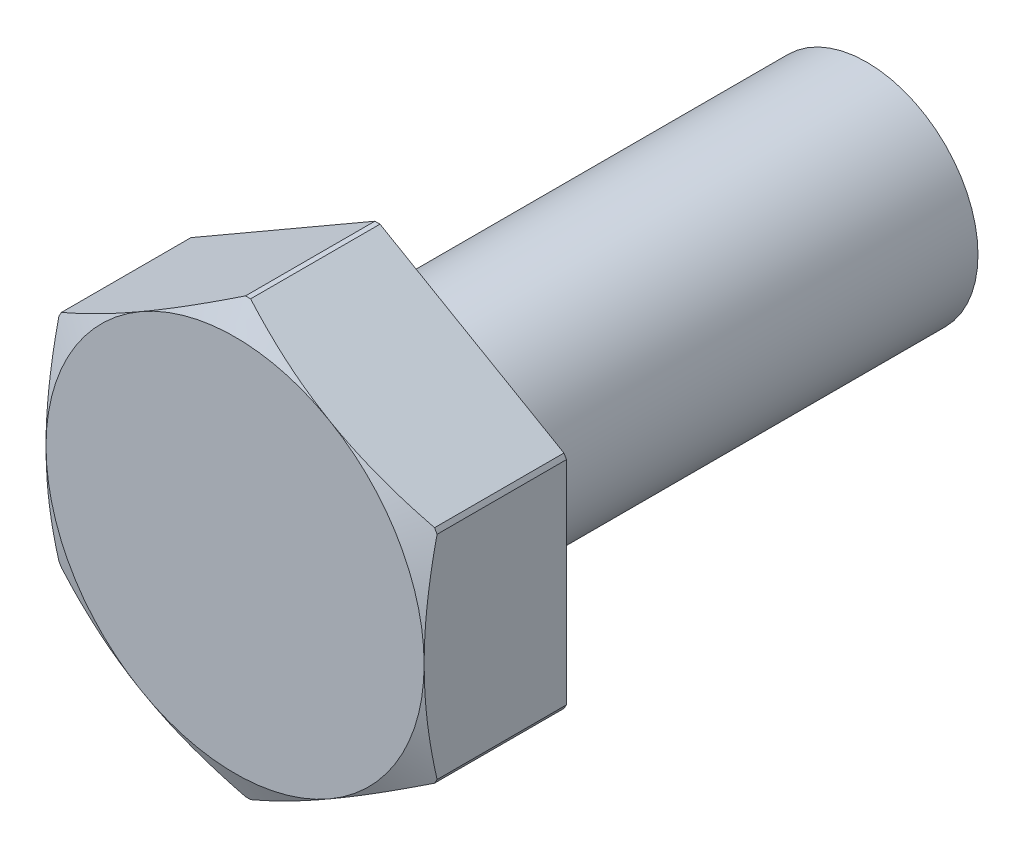
ISO-10303-21;
HEADER;
FILE_DESCRIPTION(('STEP AP214'),'2;1');
FILE_NAME('part.step','',(''),(''),'','','');
FILE_SCHEMA(('AUTOMOTIVE_DESIGN { 1 0 10303 214 1 1 1 1 }'));
ENDSEC;
DATA;
#1=APPLICATION_CONTEXT('core data for automotive mechanical design processes');
#2=APPLICATION_PROTOCOL_DEFINITION('international standard','automotive_design',2000,#1);
#3=PRODUCT_CONTEXT('',#1,'mechanical');
#4=PRODUCT('Part','Part','',(#3));
#5=PRODUCT_RELATED_PRODUCT_CATEGORY('part','',(#4));
#6=PRODUCT_DEFINITION_FORMATION('','',#4);
#7=PRODUCT_DEFINITION_CONTEXT('part definition',#1,'design');
#8=PRODUCT_DEFINITION('design','',#6,#7);
#9=PRODUCT_DEFINITION_SHAPE('','',#8);
#10=(LENGTH_UNIT() NAMED_UNIT(*) SI_UNIT(.MILLI.,.METRE.));
#11=(NAMED_UNIT(*) PLANE_ANGLE_UNIT() SI_UNIT($,.RADIAN.));
#12=(NAMED_UNIT(*) SI_UNIT($,.STERADIAN.) SOLID_ANGLE_UNIT());
#13=UNCERTAINTY_MEASURE_WITH_UNIT(LENGTH_MEASURE(1.E-05),#10,'distance_accuracy_value','');
#14=(GEOMETRIC_REPRESENTATION_CONTEXT(3) GLOBAL_UNCERTAINTY_ASSIGNED_CONTEXT((#13)) GLOBAL_UNIT_ASSIGNED_CONTEXT((#10,
#11,#12)) REPRESENTATION_CONTEXT('',''));
#15=CARTESIAN_POINT('',(0.,0.,0.));
#16=DIRECTION('',(0.,0.,1.));
#17=DIRECTION('',(1.,0.,0.));
#18=AXIS2_PLACEMENT_3D('',#15,#16,#17);
#19=CARTESIAN_POINT('',(0.,0.,0.));
#20=DIRECTION('',(0.,0.,-1.));
#21=DIRECTION('',(0.,1.,0.));
#22=AXIS2_PLACEMENT_3D('',#19,#20,#21);
#23=CYLINDRICAL_SURFACE('',#22,5.);
#24=CARTESIAN_POINT('',(0.,0.,0.));
#25=DIRECTION('',(0.,0.,-1.));
#26=DIRECTION('',(-1.,0.,0.));
#27=AXIS2_PLACEMENT_3D('',#24,#25,#26);
#28=CIRCLE('',#27,5.);
#29=CARTESIAN_POINT('',(-5.,0.,0.));
#30=VERTEX_POINT('',#29);
#31=EDGE_CURVE('E202',#30,#30,#28,.F.);
#32=ORIENTED_EDGE('',*,*,#31,.F.);
#33=EDGE_LOOP('',(#32));
#34=FACE_BOUND('',#33,.T.);
#35=CARTESIAN_POINT('',(0.,0.,-22.));
#36=DIRECTION('',(0.,0.,-1.));
#37=DIRECTION('',(0.,1.,0.));
#38=AXIS2_PLACEMENT_3D('',#35,#36,#37);
#39=CIRCLE('',#38,5.);
#40=CARTESIAN_POINT('',(0.,5.,-22.));
#41=VERTEX_POINT('',#40);
#42=EDGE_CURVE('E205',#41,#41,#39,.T.);
#43=ORIENTED_EDGE('',*,*,#42,.F.);
#44=EDGE_LOOP('',(#43));
#45=FACE_BOUND('',#44,.T.);
#46=ADVANCED_FACE('F41',(#34,#45),#23,.T.);
#47=CARTESIAN_POINT('',(0.,0.,-22.));
#48=DIRECTION('',(0.,0.,-1.));
#49=DIRECTION('',(0.,1.,0.));
#50=AXIS2_PLACEMENT_3D('',#47,#48,#49);
#51=PLANE('',#50);
#52=ORIENTED_EDGE('',*,*,#42,.T.);
#53=EDGE_LOOP('',(#52));
#54=FACE_BOUND('',#53,.T.);
#55=ADVANCED_FACE('F327',(#54),#51,.T.);
#56=CARTESIAN_POINT('',(8.49999999999999,4.90747728811183,6.4));
#57=DIRECTION('',(-0.5,-0.866025403784438,0.));
#58=DIRECTION('',(0.866025403784439,-0.5,0.));
#59=AXIS2_PLACEMENT_3D('',#56,#57,#58);
#60=PLANE('',#59);
#61=DIRECTION('',(-0.866025403784439,0.5,0.));
#62=VECTOR('',#61,1.);
#63=CARTESIAN_POINT('',(8.49999999999999,4.90747728811183,0.));
#64=LINE('',#63,#62);
#65=CARTESIAN_POINT('',(8.38494566049247,4.97390394199793,0.));
#66=VERTEX_POINT('',#65);
#67=CARTESIAN_POINT('',(0.115054339507531,9.74852792233753,0.));
#68=VERTEX_POINT('',#67);
#69=EDGE_CURVE('E168',#66,#68,#64,.T.);
#70=ORIENTED_EDGE('',*,*,#69,.T.);
#71=DIRECTION('',(0.,0.,-1.));
#72=VECTOR('',#71,1.);
#73=CARTESIAN_POINT('',(0.115054339507526,9.74852792233753,0.));
#74=LINE('',#73,#72);
#75=CARTESIAN_POINT('',(0.115054339507535,9.74852792233753,5.81748528043192));
#76=VERTEX_POINT('',#75);
#77=EDGE_CURVE('E148',#68,#76,#74,.F.);
#78=ORIENTED_EDGE('',*,*,#77,.T.);
#79=CARTESIAN_POINT('',(0.114295957680367,9.74896577428959,5.81728528043192));
#80=CARTESIAN_POINT('',(0.368748378519884,9.60205760062195,5.88439408273517));
#81=CARTESIAN_POINT('',(0.624132610704913,9.45461144542313,5.94704387090896));
#82=CARTESIAN_POINT('',(1.13678161552989,9.15863340448764,6.0619326461379));
#83=CARTESIAN_POINT('',(1.39404729707737,9.01010099399295,6.11416620210143));
#84=CARTESIAN_POINT('',(1.91041340277676,8.711976883867,6.20669299734237));
#85=CARTESIAN_POINT('',(2.16951510638425,8.56238444554173,6.24697685046727));
#86=CARTESIAN_POINT('',(2.68898544678042,8.26246810467798,6.31413320836077));
#87=CARTESIAN_POINT('',(2.94935384329133,8.11214434086393,6.34100816361651));
#88=CARTESIAN_POINT('',(3.46568333302973,7.81404137097292,6.37989393997882));
#89=CARTESIAN_POINT('',(3.72162799990124,7.66627164865701,6.39219226634545));
#90=CARTESIAN_POINT('',(4.23375156730204,7.3705969691598,6.40238558113719));
#91=CARTESIAN_POINT('',(4.4899304812466,7.22269200423321,6.40027968527784));
#92=CARTESIAN_POINT('',(5.00166928701166,6.92723946696997,6.38176001965257));
#93=CARTESIAN_POINT('',(5.25722952429058,6.77969169518282,6.36535876678634));
#94=CARTESIAN_POINT('',(5.76738905749601,6.48515095135702,6.31893257207433));
#95=CARTESIAN_POINT('',(6.02198844109896,6.33815792869834,6.28890890512109));
#96=CARTESIAN_POINT('',(6.45259775243271,6.08954552688424,6.22738921407857));
#97=CARTESIAN_POINT('',(6.62896152815605,5.98772185349507,6.19911759925731));
#98=CARTESIAN_POINT('',(6.98093458100912,5.78451011668285,6.13697504631877));
#99=CARTESIAN_POINT('',(7.15654391144361,5.6831220224843,6.10310451069344));
#100=CARTESIAN_POINT('',(7.50824732553324,5.48006596168473,6.02997476402398));
#101=CARTESIAN_POINT('',(7.68433547306051,5.37840142230876,5.99067774752279));
#102=CARTESIAN_POINT('',(8.03565930027249,5.1755645160952,5.90738378565997));
#103=CARTESIAN_POINT('',(8.21089506378212,5.07439210086126,5.86338731263727));
#104=CARTESIAN_POINT('',(8.38570404232108,4.97346609004503,5.81728528043154));
#105=B_SPLINE_CURVE_WITH_KNOTS('',3,(#79,#80,#81,#82,#83,#84,#85,#86,#87,#88,#89,#90,#91,#92,
#93,#94,#95,#96,#97,#98,#99,#100,#101,#102,#103,#104),.UNSPECIFIED.,.F.,.F.,(4,2,2,2,2,2,2,2,2,
2,2,2,4),(0.,0.904197868867345,1.80886596676229,2.71424278554767,3.61945408531317,
4.50649730500268,5.39359498133453,6.27991670148044,7.16615548978059,7.78288131449349,
8.39956282364626,9.02078053104709,9.64193585895891),.UNSPECIFIED.);
#106=CARTESIAN_POINT('',(4.25,7.36121593216773,6.4));
#107=VERTEX_POINT('',#106);
#108=EDGE_CURVE('E177',#76,#107,#105,.T.);
#109=ORIENTED_EDGE('',*,*,#108,.T.);
#110=CARTESIAN_POINT('',(8.38494566049246,4.97390394199793,5.81748528043192));
#111=VERTEX_POINT('',#110);
#112=EDGE_CURVE('E181',#107,#111,#105,.T.);
#113=ORIENTED_EDGE('',*,*,#112,.T.);
#114=DIRECTION('',(0.,0.,-1.));
#115=VECTOR('',#114,1.);
#116=CARTESIAN_POINT('',(8.38494566049247,4.97390394199792,0.));
#117=LINE('',#116,#115);
#118=EDGE_CURVE('E159',#111,#66,#117,.T.);
#119=ORIENTED_EDGE('',*,*,#118,.T.);
#120=EDGE_LOOP('',(#70,#78,#109,#113,#119));
#121=FACE_BOUND('',#120,.T.);
#122=ADVANCED_FACE('F175',(#121),#60,.F.);
#123=CARTESIAN_POINT('',(0.,9.81495457622364,6.4));
#124=DIRECTION('',(0.5,-0.866025403784439,0.));
#125=DIRECTION('',(0.866025403784439,0.5,0.));
#126=AXIS2_PLACEMENT_3D('',#123,#124,#125);
#127=PLANE('',#126);
#128=DIRECTION('',(-0.866025403784439,-0.5,0.));
#129=VECTOR('',#128,1.);
#130=CARTESIAN_POINT('',(0.,9.81495457622364,0.));
#131=LINE('',#130,#129);
#132=CARTESIAN_POINT('',(-0.115054339507537,9.74852792233753,0.));
#133=VERTEX_POINT('',#132);
#134=CARTESIAN_POINT('',(-8.38494566049246,4.97390394199793,0.));
#135=VERTEX_POINT('',#134);
#136=EDGE_CURVE('E171',#133,#135,#131,.T.);
#137=ORIENTED_EDGE('',*,*,#136,.T.);
#138=DIRECTION('',(0.,0.,-1.));
#139=VECTOR('',#138,1.);
#140=CARTESIAN_POINT('',(-8.38494566049246,4.97390394199793,0.));
#141=LINE('',#140,#139);
#142=CARTESIAN_POINT('',(-8.38494566049246,4.97390394199794,5.81748528043192));
#143=VERTEX_POINT('',#142);
#144=EDGE_CURVE('E260',#135,#143,#141,.F.);
#145=ORIENTED_EDGE('',*,*,#144,.T.);
#146=CARTESIAN_POINT('',(-8.38570404232108,4.97346609004504,5.81728528043153));
#147=CARTESIAN_POINT('',(-8.13125162148153,5.1203742637127,5.88439408273481));
#148=CARTESIAN_POINT('',(-7.87586738929647,5.26782041891153,5.94704387090863));
#149=CARTESIAN_POINT('',(-7.36321838447143,5.56379845984706,6.06193264613762));
#150=CARTESIAN_POINT('',(-7.10595270292392,5.71233087034177,6.11416620210118));
#151=CARTESIAN_POINT('',(-6.58958659722446,6.01045498046775,6.20669299734217));
#152=CARTESIAN_POINT('',(-6.33048489361693,6.16004741879305,6.2469768504671));
#153=CARTESIAN_POINT('',(-5.8110145532207,6.45996375965684,6.31413320836065));
#154=CARTESIAN_POINT('',(-5.55064615670975,6.61028752347091,6.3410081636164));
#155=CARTESIAN_POINT('',(-5.03431666697128,6.90839049336195,6.37989393997877));
#156=CARTESIAN_POINT('',(-4.77837200009974,7.05616021567789,6.39219226634541));
#157=CARTESIAN_POINT('',(-4.26624843269887,7.35183489517513,6.40238558113719));
#158=CARTESIAN_POINT('',(-4.01006951875427,7.49973986010175,6.40027968527785));
#159=CARTESIAN_POINT('',(-3.49833071298915,7.79519239736502,6.38176001965262));
#160=CARTESIAN_POINT('',(-3.24277047571019,7.94274016915219,6.36535876678639));
#161=CARTESIAN_POINT('',(-2.73261094250469,8.23728091297804,6.3189325720744));
#162=CARTESIAN_POINT('',(-2.47801155890171,8.38427393563674,6.28890890512118));
#163=CARTESIAN_POINT('',(-2.04740224756799,8.63288633745081,6.22738921407868));
#164=CARTESIAN_POINT('',(-1.87103847184471,8.73471001083995,6.19911759925743));
#165=CARTESIAN_POINT('',(-1.51906541899178,8.93792174765208,6.13697504631894));
#166=CARTESIAN_POINT('',(-1.34345608855737,9.0393098418506,6.10310451069363));
#167=CARTESIAN_POINT('',(-0.991752674467875,9.24236590265008,6.02997476402422));
#168=CARTESIAN_POINT('',(-0.815664526940676,9.34403044202601,5.99067774752306));
#169=CARTESIAN_POINT('',(-0.464340699728832,9.5468673482395,5.9073837856603));
#170=CARTESIAN_POINT('',(-0.28910493621927,9.6480397634734,5.86338731263763));
#171=CARTESIAN_POINT('',(-0.114295957680373,9.74896577428959,5.81728528043192));
#172=B_SPLINE_CURVE_WITH_KNOTS('',3,(#146,#147,#148,#149,#150,#151,#152,#153,#154,#155,#156,
#157,#158,#159,#160,#161,#162,#163,#164,#165,#166,#167,#168,#169,#170,#171),.UNSPECIFIED.,.F.,
.F.,(4,2,2,2,2,2,2,2,2,2,2,2,4),(0.,0.904197868867468,1.80886596676253,2.71424278554804,
3.61945408531367,4.5064973050033,5.39359498133527,6.27991670148131,7.16615548978157,
7.78288131449423,8.39956282364675,9.02078053104733,9.6419358589589),.UNSPECIFIED.);
#173=CARTESIAN_POINT('',(-4.25,7.36121593216773,6.4));
#174=VERTEX_POINT('',#173);
#175=EDGE_CURVE('E320',#143,#174,#172,.T.);
#176=ORIENTED_EDGE('',*,*,#175,.T.);
#177=CARTESIAN_POINT('',(-0.115054339507542,9.74852792233753,5.81748528043192));
#178=VERTEX_POINT('',#177);
#179=EDGE_CURVE('E314',#174,#178,#172,.T.);
#180=ORIENTED_EDGE('',*,*,#179,.T.);
#181=DIRECTION('',(0.,0.,-1.));
#182=VECTOR('',#181,1.);
#183=CARTESIAN_POINT('',(-0.115054339507535,9.74852792233753,0.));
#184=LINE('',#183,#182);
#185=EDGE_CURVE('E258',#178,#133,#184,.T.);
#186=ORIENTED_EDGE('',*,*,#185,.T.);
#187=EDGE_LOOP('',(#137,#145,#176,#180,#186));
#188=FACE_BOUND('',#187,.T.);
#189=ADVANCED_FACE('F321',(#188),#127,.F.);
#190=CARTESIAN_POINT('',(-8.49999999999999,4.90747728811183,6.4));
#191=DIRECTION('',(1.,0.,0.));
#192=DIRECTION('',(0.,1.,0.));
#193=AXIS2_PLACEMENT_3D('',#190,#191,#192);
#194=PLANE('',#193);
#195=DIRECTION('',(0.,-1.,0.));
#196=VECTOR('',#195,1.);
#197=CARTESIAN_POINT('',(-8.49999999999999,4.90747728811183,0.));
#198=LINE('',#197,#196);
#199=CARTESIAN_POINT('',(-8.49999999999999,4.77462398033962,0.));
#200=VERTEX_POINT('',#199);
#201=CARTESIAN_POINT('',(-8.49999999999999,-4.77462398033962,0.));
#202=VERTEX_POINT('',#201);
#203=EDGE_CURVE('E179',#200,#202,#198,.T.);
#204=ORIENTED_EDGE('',*,*,#203,.T.);
#205=DIRECTION('',(0.,0.,-1.));
#206=VECTOR('',#205,1.);
#207=CARTESIAN_POINT('',(-8.49999999999998,-4.77462398033963,0.));
#208=LINE('',#207,#206);
#209=CARTESIAN_POINT('',(-8.49999999999999,-4.77462398033962,5.81748528043192));
#210=VERTEX_POINT('',#209);
#211=EDGE_CURVE('E255',#202,#210,#208,.F.);
#212=ORIENTED_EDGE('',*,*,#211,.T.);
#213=CARTESIAN_POINT('',(-8.49999999999998,-13.0055728494876,3.1186446895037));
#214=CARTESIAN_POINT('',(-8.49999999999998,-12.6236113714636,3.26769442816254));
#215=CARTESIAN_POINT('',(-8.49999999999998,-12.2410019908623,3.41511460764558));
#216=CARTESIAN_POINT('',(-8.49999999999998,-11.4741438552404,3.70577155724618));
#217=CARTESIAN_POINT('',(-8.49999999999998,-11.0898948981786,3.84900779366108));
#218=CARTESIAN_POINT('',(-8.49999999999998,-10.3182049069868,4.13081114994341));
#219=CARTESIAN_POINT('',(-8.49999999999999,-9.93075746722823,4.26936079239417));
#220=CARTESIAN_POINT('',(-8.49999999999999,-9.15360678955333,4.53996371788897));
#221=CARTESIAN_POINT('',(-8.49999999999999,-8.76390363027252,4.67201722588508));
#222=CARTESIAN_POINT('',(-8.49999999999999,-7.98699304569603,4.92625020867573));
#223=CARTESIAN_POINT('',(-8.49999999999999,-7.59982104407757,5.04853739168555));
#224=CARTESIAN_POINT('',(-8.49999999999999,-6.82240006662922,5.28305967827671));
#225=CARTESIAN_POINT('',(-8.49999999999999,-6.43215093269667,5.39529426164652));
#226=CARTESIAN_POINT('',(-8.49999999999999,-5.64857586601971,5.60694510843903));
#227=CARTESIAN_POINT('',(-8.49999999999999,-5.2552533403401,5.70637388176925));
#228=CARTESIAN_POINT('',(-8.49999999999999,-4.4649154233197,5.8892987888121));
#229=CARTESIAN_POINT('',(-8.49999999999999,-4.0679005555984,5.97279714658327));
#230=CARTESIAN_POINT('',(-8.49999999999999,-3.3966927498546,6.09683587343487));
#231=CARTESIAN_POINT('',(-8.49999999999999,-3.12346599596478,6.14260286278407));
#232=CARTESIAN_POINT('',(-8.49999999999999,-2.57547327150274,6.22382192646634));
#233=CARTESIAN_POINT('',(-8.49999999999999,-2.3007073387721,6.25927425326671));
#234=CARTESIAN_POINT('',(-8.49999999999999,-1.75006498070165,6.31878757848712));
#235=CARTESIAN_POINT('',(-8.49999999999999,-1.47418914552003,6.34285398542085));
#236=CARTESIAN_POINT('',(-8.49999999999999,-0.921638292007667,6.37880951798559));
#237=CARTESIAN_POINT('',(-8.49999999999999,-0.644963280134812,6.39069874174205));
#238=CARTESIAN_POINT('',(-8.49999999999999,-0.0901817416354904,6.40189266512031));
#239=CARTESIAN_POINT('',(-8.49999999999999,0.187925880798553,6.40114379453006));
#240=CARTESIAN_POINT('',(-8.49999999999999,0.743816318512034,6.38695860508124));
#241=CARTESIAN_POINT('',(-8.49999999999999,1.02159912940412,6.37352211678394));
#242=CARTESIAN_POINT('',(-8.49999999999999,1.57634660652873,6.33444562684688));
#243=CARTESIAN_POINT('',(-8.49999999999999,1.85331112395366,6.30880352835232));
#244=CARTESIAN_POINT('',(-8.49999999999999,2.4059211960765,6.24617960593438));
#245=CARTESIAN_POINT('',(-8.49999999999999,2.68156679098249,6.20919812996402));
#246=CARTESIAN_POINT('',(-8.49999999999999,3.69910269416636,6.05332554763144));
#247=CARTESIAN_POINT('',(-8.49999999999999,4.43614530865584,5.90214348220122));
#248=CARTESIAN_POINT('',(-8.49999999999999,5.53206397682524,5.63671689769451));
#249=CARTESIAN_POINT('',(-8.49999999999999,5.89599323424382,5.54172568544557));
#250=CARTESIAN_POINT('',(-8.49999999999999,6.62097423389572,5.34128183556652));
#251=CARTESIAN_POINT('',(-8.49999999999999,6.98202615484924,5.23582985324529));
#252=CARTESIAN_POINT('',(-8.49999999999999,7.70352621406965,5.01591066544456));
#253=CARTESIAN_POINT('',(-8.49999999999999,8.06395995575284,4.90139680265189));
#254=CARTESIAN_POINT('',(-8.49999999999999,8.78257893874545,4.66552285346253));
#255=CARTESIAN_POINT('',(-8.49999999999999,9.14076415606734,4.54416269416617));
#256=CARTESIAN_POINT('',(-8.49999999999999,9.85503014903381,4.29596971049876));
#257=CARTESIAN_POINT('',(-8.49999999999999,10.2111118651333,4.16913958182559));
#258=CARTESIAN_POINT('',(-8.49999999999999,10.921634077964,3.91097969067251));
#259=CARTESIAN_POINT('',(-8.49999999999999,11.2760745844378,3.77964995494277));
#260=CARTESIAN_POINT('',(-8.49999999999999,11.9849239673444,3.51278760846573));
#261=CARTESIAN_POINT('',(-8.49999999999999,12.3393274788915,3.37724077552879));
#262=CARTESIAN_POINT('',(-8.49999999999999,13.0469426613599,3.1030677935147));
#263=CARTESIAN_POINT('',(-8.5,13.4001543221802,2.96444161841502));
#264=CARTESIAN_POINT('',(-8.5,14.458355679725,2.54470720998344));
#265=CARTESIAN_POINT('',(-8.5,15.1618282124487,2.25977483981285));
#266=CARTESIAN_POINT('',(-8.5,16.5568272047265,1.68638397809293));
#267=CARTESIAN_POINT('',(-8.5,17.2483914691913,1.3980170321228));
#268=CARTESIAN_POINT('',(-8.5,18.2840178194632,0.9616037785216));
#269=CARTESIAN_POINT('',(-8.5,18.628902471974,0.815505005247487));
#270=CARTESIAN_POINT('',(-8.5,19.3181874227747,0.522174840015516));
#271=CARTESIAN_POINT('',(-8.5,19.6625877239855,0.374943454923121));
#272=CARTESIAN_POINT('',(-8.5,20.0067797905317,0.22722736956378));
#273=B_SPLINE_CURVE_WITH_KNOTS('',3,(#213,#214,#215,#216,#217,#218,#219,#220,#221,#222,#223,
#224,#225,#226,#227,#228,#229,#230,#231,#232,#233,#234,#235,#236,#237,#238,#239,#240,#241,#242,
#243,#244,#245,#246,#247,#248,#249,#250,#251,#252,#253,#254,#255,#256,#257,#258,#259,#260,#261,
#262,#263,#264,#265,#266,#267,#268,#269,#270,#271,#272),.UNSPECIFIED.,.F.,.F.,(4,2,2,2,2,2,2,2,
2,2,2,2,2,2,2,2,2,2,2,2,2,2,2,2,2,2,2,2,2,4),(0.,1.2300510540079,2.46025833380435,
3.69463667636664,4.92897224399588,6.14694106702368,7.364972882294,8.58180563672979,
9.79846838362138,10.6294008191662,11.4603129146447,12.2908299148731,13.1213402226265,
13.9553717690376,14.7894144538069,15.6236004741332,16.4577608997119,18.7114943596639,
19.8398110234478,20.9680570490705,22.1025462924587,23.2370476182184,24.3709960913688,
25.504937824363,26.6432408835412,27.7815535658139,30.0584470047,32.3062535012335,
33.4299120943287,34.5535638815888),.UNSPECIFIED.);
#274=CARTESIAN_POINT('',(-8.49999999999999,0.,6.4));
#275=VERTEX_POINT('',#274);
#276=EDGE_CURVE('E313',#210,#275,#273,.T.);
#277=ORIENTED_EDGE('',*,*,#276,.T.);
#278=CARTESIAN_POINT('',(-8.49999999999999,4.77462398033961,5.81748528043192));
#279=VERTEX_POINT('',#278);
#280=EDGE_CURVE('E307',#275,#279,#273,.T.);
#281=ORIENTED_EDGE('',*,*,#280,.T.);
#282=DIRECTION('',(0.,0.,-1.));
#283=VECTOR('',#282,1.);
#284=CARTESIAN_POINT('',(-8.49999999999999,4.77462398033962,0.));
#285=LINE('',#284,#283);
#286=EDGE_CURVE('E253',#279,#200,#285,.T.);
#287=ORIENTED_EDGE('',*,*,#286,.T.);
#288=EDGE_LOOP('',(#204,#212,#277,#281,#287));
#289=FACE_BOUND('',#288,.T.);
#290=ADVANCED_FACE('F294',(#289),#194,.F.);
#291=CARTESIAN_POINT('',(-8.49999999999999,-4.90747728811182,6.4));
#292=DIRECTION('',(0.5,0.866025403784439,0.));
#293=DIRECTION('',(-0.866025403784439,0.5,0.));
#294=AXIS2_PLACEMENT_3D('',#291,#292,#293);
#295=PLANE('',#294);
#296=DIRECTION('',(0.866025403784439,-0.5,0.));
#297=VECTOR('',#296,1.);
#298=CARTESIAN_POINT('',(-8.49999999999999,-4.90747728811182,0.));
#299=LINE('',#298,#297);
#300=CARTESIAN_POINT('',(-8.38494566049247,-4.97390394199792,0.));
#301=VERTEX_POINT('',#300);
#302=CARTESIAN_POINT('',(-0.115054339507517,-9.74852792233753,0.));
#303=VERTEX_POINT('',#302);
#304=EDGE_CURVE('E193',#301,#303,#299,.T.);
#305=ORIENTED_EDGE('',*,*,#304,.T.);
#306=DIRECTION('',(0.,0.,-1.));
#307=VECTOR('',#306,1.);
#308=CARTESIAN_POINT('',(-0.115054339507515,-9.74852792233753,0.));
#309=LINE('',#308,#307);
#310=CARTESIAN_POINT('',(-0.115054339507517,-9.74852792233753,5.81748528043192));
#311=VERTEX_POINT('',#310);
#312=EDGE_CURVE('E250',#303,#311,#309,.F.);
#313=ORIENTED_EDGE('',*,*,#312,.T.);
#314=CARTESIAN_POINT('',(-0.114295957680362,-9.74896577428959,5.81728528043192));
#315=CARTESIAN_POINT('',(-0.368748378519878,-9.60205760062194,5.88439408273517));
#316=CARTESIAN_POINT('',(-0.624132610704907,-9.45461144542313,5.94704387090896));
#317=CARTESIAN_POINT('',(-1.13678161552988,-9.15863340448764,6.0619326461379));
#318=CARTESIAN_POINT('',(-1.39404729707736,-9.01010099399294,6.11416620210143));
#319=CARTESIAN_POINT('',(-1.91041340277676,-8.711976883867,6.20669299734237));
#320=CARTESIAN_POINT('',(-2.16951510638425,-8.56238444554173,6.24697685046727));
#321=CARTESIAN_POINT('',(-2.68898544678041,-8.26246810467797,6.31413320836077));
#322=CARTESIAN_POINT('',(-2.94935384329133,-8.11214434086393,6.34100816361651));
#323=CARTESIAN_POINT('',(-3.46568333302972,-7.81404137097292,6.37989393997882));
#324=CARTESIAN_POINT('',(-3.72162799990123,-7.66627164865701,6.39219226634545));
#325=CARTESIAN_POINT('',(-4.23375156730204,-7.3705969691598,6.40238558113719));
#326=CARTESIAN_POINT('',(-4.48993048124659,-7.2226920042332,6.40027968527784));
#327=CARTESIAN_POINT('',(-5.00166928701165,-6.92723946696997,6.38176001965258));
#328=CARTESIAN_POINT('',(-5.25722952429057,-6.77969169518282,6.36535876678634));
#329=CARTESIAN_POINT('',(-5.767389057496,-6.48515095135701,6.31893257207433));
#330=CARTESIAN_POINT('',(-6.02198844109895,-6.33815792869834,6.28890890512109));
#331=CARTESIAN_POINT('',(-6.4525977524327,-6.08954552688424,6.22738921407858));
#332=CARTESIAN_POINT('',(-6.62896152815605,-5.98772185349506,6.19911759925731));
#333=CARTESIAN_POINT('',(-6.98093458100912,-5.78451011668285,6.13697504631877));
#334=CARTESIAN_POINT('',(-7.1565439114436,-5.68312202248429,6.10310451069344));
#335=CARTESIAN_POINT('',(-7.50824732553324,-5.48006596168473,6.02997476402398));
#336=CARTESIAN_POINT('',(-7.68433547306051,-5.37840142230876,5.9906777475228));
#337=CARTESIAN_POINT('',(-8.03565930027249,-5.17556451609519,5.90738378565997));
#338=CARTESIAN_POINT('',(-8.21089506378212,-5.07439210086125,5.86338731263727));
#339=CARTESIAN_POINT('',(-8.38570404232109,-4.97346609004502,5.81728528043154));
#340=B_SPLINE_CURVE_WITH_KNOTS('',3,(#314,#315,#316,#317,#318,#319,#320,#321,#322,#323,#324,
#325,#326,#327,#328,#329,#330,#331,#332,#333,#334,#335,#336,#337,#338,#339),.UNSPECIFIED.,.F.,
.F.,(4,2,2,2,2,2,2,2,2,2,2,2,4),(0.,0.904197868867344,1.80886596676229,2.71424278554767,
3.61945408531317,4.50649730500267,5.39359498133452,6.27991670148044,7.16615548978058,
7.78288131449349,8.39956282364627,9.02078053104709,9.64193585895892),.UNSPECIFIED.);
#341=CARTESIAN_POINT('',(-4.25,-7.36121593216773,6.4));
#342=VERTEX_POINT('',#341);
#343=EDGE_CURVE('E305',#311,#342,#340,.T.);
#344=ORIENTED_EDGE('',*,*,#343,.T.);
#345=CARTESIAN_POINT('',(-8.38494566049248,-4.97390394199792,5.81748528043192));
#346=VERTEX_POINT('',#345);
#347=EDGE_CURVE('E298',#342,#346,#340,.T.);
#348=ORIENTED_EDGE('',*,*,#347,.T.);
#349=DIRECTION('',(0.,0.,-1.));
#350=VECTOR('',#349,1.);
#351=CARTESIAN_POINT('',(-8.38494566049248,-4.97390394199791,0.));
#352=LINE('',#351,#350);
#353=EDGE_CURVE('E248',#346,#301,#352,.T.);
#354=ORIENTED_EDGE('',*,*,#353,.T.);
#355=EDGE_LOOP('',(#305,#313,#344,#348,#354));
#356=FACE_BOUND('',#355,.T.);
#357=ADVANCED_FACE('F289',(#356),#295,.F.);
#358=CARTESIAN_POINT('',(0.,-9.81495457622363,6.4));
#359=DIRECTION('',(-0.5,0.866025403784439,0.));
#360=DIRECTION('',(-0.866025403784439,-0.5,0.));
#361=AXIS2_PLACEMENT_3D('',#358,#359,#360);
#362=PLANE('',#361);
#363=DIRECTION('',(0.866025403784439,0.5,0.));
#364=VECTOR('',#363,1.);
#365=CARTESIAN_POINT('',(0.,-9.81495457622363,0.));
#366=LINE('',#365,#364);
#367=CARTESIAN_POINT('',(0.115054339507521,-9.74852792233753,0.));
#368=VERTEX_POINT('',#367);
#369=CARTESIAN_POINT('',(8.38494566049247,-4.97390394199793,0.));
#370=VERTEX_POINT('',#369);
#371=EDGE_CURVE('E196',#368,#370,#366,.T.);
#372=ORIENTED_EDGE('',*,*,#371,.T.);
#373=DIRECTION('',(0.,0.,-1.));
#374=VECTOR('',#373,1.);
#375=CARTESIAN_POINT('',(8.38494566049247,-4.97390394199793,0.));
#376=LINE('',#375,#374);
#377=CARTESIAN_POINT('',(8.38494566049247,-4.97390394199793,5.81748528043192));
#378=VERTEX_POINT('',#377);
#379=EDGE_CURVE('E245',#370,#378,#376,.F.);
#380=ORIENTED_EDGE('',*,*,#379,.T.);
#381=CARTESIAN_POINT('',(8.38570404232108,-4.97346609004502,5.81728528043153));
#382=CARTESIAN_POINT('',(8.13125162148154,-5.12037426371269,5.88439408273482));
#383=CARTESIAN_POINT('',(7.87586738929648,-5.26782041891152,5.94704387090863));
#384=CARTESIAN_POINT('',(7.36321838447144,-5.56379845984705,6.06193264613762));
#385=CARTESIAN_POINT('',(7.10595270292392,-5.71233087034176,6.11416620210118));
#386=CARTESIAN_POINT('',(6.58958659722446,-6.01045498046774,6.20669299734217));
#387=CARTESIAN_POINT('',(6.33048489361694,-6.16004741879303,6.2469768504671));
#388=CARTESIAN_POINT('',(5.8110145532207,-6.45996375965683,6.31413320836065));
#389=CARTESIAN_POINT('',(5.55064615670975,-6.61028752347089,6.34100816361641));
#390=CARTESIAN_POINT('',(5.03431666697129,-6.90839049336194,6.37989393997877));
#391=CARTESIAN_POINT('',(4.77837200009974,-7.05616021567787,6.39219226634541));
#392=CARTESIAN_POINT('',(4.26624843269887,-7.35183489517512,6.40238558113719));
#393=CARTESIAN_POINT('',(4.01006951875428,-7.49973986010174,6.40027968527786));
#394=CARTESIAN_POINT('',(3.49833071298915,-7.79519239736501,6.38176001965262));
#395=CARTESIAN_POINT('',(3.24277047571019,-7.94274016915218,6.3653587667864));
#396=CARTESIAN_POINT('',(2.7326109425047,-8.23728091297803,6.31893257207441));
#397=CARTESIAN_POINT('',(2.47801155890171,-8.38427393563672,6.28890890512118));
#398=CARTESIAN_POINT('',(2.047402247568,-8.6328863374508,6.22738921407869));
#399=CARTESIAN_POINT('',(1.87103847184472,-8.73471001083994,6.19911759925744));
#400=CARTESIAN_POINT('',(1.51906541899178,-8.93792174765207,6.13697504631894));
#401=CARTESIAN_POINT('',(1.34345608855737,-9.03930984185059,6.10310451069364));
#402=CARTESIAN_POINT('',(0.991752674467869,-9.24236590265007,6.02997476402422));
#403=CARTESIAN_POINT('',(0.815664526940669,-9.34403044202601,5.99067774752306));
#404=CARTESIAN_POINT('',(0.464340699728822,-9.54686734823949,5.9073837856603));
#405=CARTESIAN_POINT('',(0.289104936219259,-9.64803976347339,5.86338731263763));
#406=CARTESIAN_POINT('',(0.11429595768036,-9.74896577428959,5.81728528043192));
#407=B_SPLINE_CURVE_WITH_KNOTS('',3,(#381,#382,#383,#384,#385,#386,#387,#388,#389,#390,#391,
#392,#393,#394,#395,#396,#397,#398,#399,#400,#401,#402,#403,#404,#405,#406),.UNSPECIFIED.,.F.,
.F.,(4,2,2,2,2,2,2,2,2,2,2,2,4),(0.,0.904197868867468,1.80886596676253,2.71424278554804,
3.61945408531367,4.5064973050033,5.39359498133527,6.27991670148131,7.16615548978157,
7.78288131449423,8.39956282364676,9.02078053104734,9.64193585895892),.UNSPECIFIED.);
#408=CARTESIAN_POINT('',(4.24999999999999,-7.36121593216773,6.4));
#409=VERTEX_POINT('',#408);
#410=EDGE_CURVE('E306',#378,#409,#407,.T.);
#411=ORIENTED_EDGE('',*,*,#410,.T.);
#412=CARTESIAN_POINT('',(0.11505433950752,-9.74852792233753,5.81748528043192));
#413=VERTEX_POINT('',#412);
#414=EDGE_CURVE('E271',#409,#413,#407,.T.);
#415=ORIENTED_EDGE('',*,*,#414,.T.);
#416=DIRECTION('',(0.,0.,-1.));
#417=VECTOR('',#416,1.);
#418=CARTESIAN_POINT('',(0.11505433950752,-9.74852792233753,0.));
#419=LINE('',#418,#417);
#420=EDGE_CURVE('E238',#413,#368,#419,.T.);
#421=ORIENTED_EDGE('',*,*,#420,.T.);
#422=EDGE_LOOP('',(#372,#380,#411,#415,#421));
#423=FACE_BOUND('',#422,.T.);
#424=ADVANCED_FACE('F284',(#423),#362,.F.);
#425=CARTESIAN_POINT('',(8.49999999999999,-4.90747728811182,6.4));
#426=DIRECTION('',(-1.,0.,0.));
#427=DIRECTION('',(0.,-1.,0.));
#428=AXIS2_PLACEMENT_3D('',#425,#426,#427);
#429=PLANE('',#428);
#430=DIRECTION('',(0.,1.,0.));
#431=VECTOR('',#430,1.);
#432=CARTESIAN_POINT('',(8.49999999999999,-4.90747728811182,0.));
#433=LINE('',#432,#431);
#434=CARTESIAN_POINT('',(8.49999999999999,-4.77462398033962,0.));
#435=VERTEX_POINT('',#434);
#436=CARTESIAN_POINT('',(8.49999999999999,4.77462398033962,0.));
#437=VERTEX_POINT('',#436);
#438=EDGE_CURVE('E199',#435,#437,#433,.T.);
#439=ORIENTED_EDGE('',*,*,#438,.T.);
#440=DIRECTION('',(0.,0.,-1.));
#441=VECTOR('',#440,1.);
#442=CARTESIAN_POINT('',(8.49999999999998,4.77462398033963,0.));
#443=LINE('',#442,#441);
#444=CARTESIAN_POINT('',(8.49999999999999,4.77462398033962,5.81748528043192));
#445=VERTEX_POINT('',#444);
#446=EDGE_CURVE('E227',#437,#445,#443,.F.);
#447=ORIENTED_EDGE('',*,*,#446,.T.);
#448=CARTESIAN_POINT('',(8.49999999999999,-13.0055728494878,3.11864468950364));
#449=CARTESIAN_POINT('',(8.49999999999999,-12.6236113714637,3.26769442816247));
#450=CARTESIAN_POINT('',(8.49999999999999,-12.2410019908625,3.41511460764551));
#451=CARTESIAN_POINT('',(8.49999999999999,-11.4741438552406,3.70577155724611));
#452=CARTESIAN_POINT('',(8.49999999999999,-11.0898948981788,3.84900779366102));
#453=CARTESIAN_POINT('',(8.49999999999999,-10.318204906987,4.13081114994335));
#454=CARTESIAN_POINT('',(8.49999999999999,-9.93075746722839,4.26936079239411));
#455=CARTESIAN_POINT('',(8.49999999999999,-9.15360678955349,4.53996371788891));
#456=CARTESIAN_POINT('',(8.49999999999999,-8.76390363027268,4.67201722588503));
#457=CARTESIAN_POINT('',(8.49999999999999,-7.98699304569619,4.92625020867568));
#458=CARTESIAN_POINT('',(8.49999999999999,-7.59982104407772,5.0485373916855));
#459=CARTESIAN_POINT('',(8.49999999999999,-6.82240006662938,5.28305967827667));
#460=CARTESIAN_POINT('',(8.49999999999999,-6.43215093269682,5.39529426164648));
#461=CARTESIAN_POINT('',(8.49999999999999,-5.64857586601987,5.606945108439));
#462=CARTESIAN_POINT('',(8.49999999999999,-5.25525334034025,5.70637388176921));
#463=CARTESIAN_POINT('',(8.49999999999999,-4.46491542331985,5.88929878881207));
#464=CARTESIAN_POINT('',(8.49999999999999,-4.06790055559855,5.97279714658324));
#465=CARTESIAN_POINT('',(8.49999999999999,-3.39669274985475,6.09683587343485));
#466=CARTESIAN_POINT('',(8.49999999999999,-3.12346599596493,6.14260286278405));
#467=CARTESIAN_POINT('',(8.49999999999999,-2.57547327150288,6.22382192646632));
#468=CARTESIAN_POINT('',(8.49999999999999,-2.30070733877224,6.25927425326669));
#469=CARTESIAN_POINT('',(8.49999999999999,-1.75006498070179,6.31878757848711));
#470=CARTESIAN_POINT('',(8.49999999999999,-1.47418914552017,6.34285398542084));
#471=CARTESIAN_POINT('',(8.49999999999999,-0.921638292007797,6.37880951798558));
#472=CARTESIAN_POINT('',(8.49999999999999,-0.64496328013494,6.39069874174204));
#473=CARTESIAN_POINT('',(8.49999999999999,-0.0901817416356153,6.40189266512031));
#474=CARTESIAN_POINT('',(8.49999999999999,0.18792588079843,6.40114379453007));
#475=CARTESIAN_POINT('',(8.49999999999999,0.743816318511913,6.38695860508124));
#476=CARTESIAN_POINT('',(8.49999999999999,1.021599129404,6.37352211678395));
#477=CARTESIAN_POINT('',(8.49999999999999,1.57634660652861,6.33444562684689));
#478=CARTESIAN_POINT('',(8.49999999999999,1.85331112395354,6.30880352835233));
#479=CARTESIAN_POINT('',(8.49999999999999,2.40592119607639,6.24617960593439));
#480=CARTESIAN_POINT('',(8.49999999999999,2.68156679098239,6.20919812996403));
#481=CARTESIAN_POINT('',(8.49999999999999,3.69910269416626,6.05332554763146));
#482=CARTESIAN_POINT('',(8.49999999999999,4.43614530865574,5.90214348220125));
#483=CARTESIAN_POINT('',(8.49999999999999,5.53206397682513,5.63671689769453));
#484=CARTESIAN_POINT('',(8.49999999999999,5.89599323424371,5.5417256854456));
#485=CARTESIAN_POINT('',(8.49999999999999,6.62097423389561,5.34128183556655));
#486=CARTESIAN_POINT('',(8.49999999999999,6.98202615484913,5.23582985324532));
#487=CARTESIAN_POINT('',(8.49999999999999,7.70352621406954,5.01591066544459));
#488=CARTESIAN_POINT('',(8.49999999999999,8.06395995575273,4.90139680265193));
#489=CARTESIAN_POINT('',(8.49999999999999,8.78257893874534,4.66552285346257));
#490=CARTESIAN_POINT('',(8.49999999999999,9.14076415606723,4.54416269416621));
#491=CARTESIAN_POINT('',(8.49999999999999,9.8550301490337,4.2959697104988));
#492=CARTESIAN_POINT('',(8.49999999999998,10.2111118651332,4.16913958182563));
#493=CARTESIAN_POINT('',(8.49999999999998,10.9216340779639,3.91097969067255));
#494=CARTESIAN_POINT('',(8.49999999999998,11.2760745844377,3.77964995494281));
#495=CARTESIAN_POINT('',(8.49999999999998,11.9849239673443,3.51278760846577));
#496=CARTESIAN_POINT('',(8.49999999999998,12.3393274788914,3.37724077552883));
#497=CARTESIAN_POINT('',(8.49999999999998,13.0469426613598,3.10306779351475));
#498=CARTESIAN_POINT('',(8.49999999999998,13.4001543221801,2.96444161841507));
#499=CARTESIAN_POINT('',(8.49999999999998,14.4583556797249,2.54470720998348));
#500=CARTESIAN_POINT('',(8.49999999999998,15.1618282124486,2.25977483981289));
#501=CARTESIAN_POINT('',(8.49999999999998,16.5568272047264,1.68638397809298));
#502=CARTESIAN_POINT('',(8.49999999999998,17.2483914691912,1.39801703212285));
#503=CARTESIAN_POINT('',(8.49999999999998,18.2840178194631,0.961603778521642));
#504=CARTESIAN_POINT('',(8.49999999999998,18.6289024719739,0.815505005247528));
#505=CARTESIAN_POINT('',(8.49999999999998,19.3181874227746,0.522174840015555));
#506=CARTESIAN_POINT('',(8.49999999999998,19.6625877239854,0.374943454923162));
#507=CARTESIAN_POINT('',(8.49999999999998,20.0067797905316,0.227227369563821));
#508=B_SPLINE_CURVE_WITH_KNOTS('',3,(#448,#449,#450,#451,#452,#453,#454,#455,#456,#457,#458,
#459,#460,#461,#462,#463,#464,#465,#466,#467,#468,#469,#470,#471,#472,#473,#474,#475,#476,#477,
#478,#479,#480,#481,#482,#483,#484,#485,#486,#487,#488,#489,#490,#491,#492,#493,#494,#495,#496,
#497,#498,#499,#500,#501,#502,#503,#504,#505,#506,#507),.UNSPECIFIED.,.F.,.F.,(4,2,2,2,2,2,2,2,
2,2,2,2,2,2,2,2,2,2,2,2,2,2,2,2,2,2,2,2,2,4),(0.,1.2300510540079,2.46025833380436,
3.69463667636664,4.92897224399588,6.14694106702369,7.36497288229402,8.58180563672981,
9.7984683836214,10.6294008191662,11.4603129146447,12.2908299148731,13.1213402226266,
13.9553717690377,14.789414453807,15.6236004741333,16.457760899712,18.711494359664,
19.8398110234479,20.9680570490706,22.1025462924587,23.2370476182185,24.3709960913689,
25.5049378243631,26.6432408835412,27.781553565814,30.0584470047001,32.3062535012336,
33.4299120943288,34.5535638815889),.UNSPECIFIED.);
#509=CARTESIAN_POINT('',(8.5,0.,6.4));
#510=VERTEX_POINT('',#509);
#511=EDGE_CURVE('E270',#445,#510,#508,.F.);
#512=ORIENTED_EDGE('',*,*,#511,.T.);
#513=CARTESIAN_POINT('',(8.49999999999999,-4.77462398033962,5.81748528043192));
#514=VERTEX_POINT('',#513);
#515=EDGE_CURVE('E158',#510,#514,#508,.F.);
#516=ORIENTED_EDGE('',*,*,#515,.T.);
#517=DIRECTION('',(0.,0.,-1.));
#518=VECTOR('',#517,1.);
#519=CARTESIAN_POINT('',(8.49999999999998,-4.77462398033963,0.));
#520=LINE('',#519,#518);
#521=EDGE_CURVE('E233',#514,#435,#520,.T.);
#522=ORIENTED_EDGE('',*,*,#521,.T.);
#523=EDGE_LOOP('',(#439,#447,#512,#516,#522));
#524=FACE_BOUND('',#523,.T.);
#525=ADVANCED_FACE('F230',(#524),#429,.F.);
#526=CARTESIAN_POINT('',(8.49999999999999,4.90747728811183,0.));
#527=DIRECTION('',(0.,0.,-1.));
#528=DIRECTION('',(-1.,0.,0.));
#529=AXIS2_PLACEMENT_3D('',#526,#527,#528);
#530=PLANE('',#529);
#531=CARTESIAN_POINT('',(0.,0.,0.));
#532=DIRECTION('',(0.,0.,-1.));
#533=DIRECTION('',(-1.,0.,0.));
#534=AXIS2_PLACEMENT_3D('',#531,#532,#533);
#535=CIRCLE('',#534,9.74920684741246);
#536=EDGE_CURVE('E207',#202,#301,#535,.F.);
#537=ORIENTED_EDGE('',*,*,#536,.F.);
#538=ORIENTED_EDGE('',*,*,#203,.F.);
#539=EDGE_CURVE('E173',#135,#200,#535,.F.);
#540=ORIENTED_EDGE('',*,*,#539,.F.);
#541=ORIENTED_EDGE('',*,*,#136,.F.);
#542=EDGE_CURVE('E151',#68,#133,#535,.F.);
#543=ORIENTED_EDGE('',*,*,#542,.F.);
#544=ORIENTED_EDGE('',*,*,#69,.F.);
#545=EDGE_CURVE('E172',#437,#66,#535,.F.);
#546=ORIENTED_EDGE('',*,*,#545,.F.);
#547=ORIENTED_EDGE('',*,*,#438,.F.);
#548=EDGE_CURVE('E215',#370,#435,#535,.F.);
#549=ORIENTED_EDGE('',*,*,#548,.F.);
#550=ORIENTED_EDGE('',*,*,#371,.F.);
#551=EDGE_CURVE('E210',#303,#368,#535,.F.);
#552=ORIENTED_EDGE('',*,*,#551,.F.);
#553=ORIENTED_EDGE('',*,*,#304,.F.);
#554=EDGE_LOOP('',(#537,#538,#540,#541,#543,#544,#546,#547,#549,#550,#552,#553));
#555=FACE_BOUND('',#554,.T.);
#556=ORIENTED_EDGE('',*,*,#31,.T.);
#557=EDGE_LOOP('',(#556));
#558=FACE_BOUND('',#557,.T.);
#559=ADVANCED_FACE('F165',(#555,#558),#530,.T.);
#560=CARTESIAN_POINT('',(0.,0.,0.));
#561=DIRECTION('',(0.,0.,-1.));
#562=DIRECTION('',(0.,1.,0.));
#563=AXIS2_PLACEMENT_3D('',#560,#561,#562);
#564=CYLINDRICAL_SURFACE('',#563,9.74920684741246);
#565=ORIENTED_EDGE('',*,*,#539,.T.);
#566=ORIENTED_EDGE('',*,*,#286,.F.);
#567=CARTESIAN_POINT('',(0.,0.,5.81748528043192));
#568=DIRECTION('',(0.,0.,-1.));
#569=DIRECTION('',(0.,1.,0.));
#570=AXIS2_PLACEMENT_3D('',#567,#568,#569);
#571=CIRCLE('',#570,9.74920684741246);
#572=EDGE_CURVE('E398',#279,#143,#571,.T.);
#573=ORIENTED_EDGE('',*,*,#572,.T.);
#574=ORIENTED_EDGE('',*,*,#144,.F.);
#575=EDGE_LOOP('',(#565,#566,#573,#574));
#576=FACE_BOUND('',#575,.T.);
#577=ADVANCED_FACE('F340',(#576),#564,.T.);
#578=CARTESIAN_POINT('',(0.,0.,6.4));
#579=DIRECTION('',(0.,0.,-1.));
#580=DIRECTION('',(0.,1.,0.));
#581=AXIS2_PLACEMENT_3D('',#578,#579,#580);
#582=CONICAL_SURFACE('',#581,8.5,1.13446401379632);
#583=ORIENTED_EDGE('',*,*,#572,.F.);
#584=ORIENTED_EDGE('',*,*,#280,.F.);
#585=CARTESIAN_POINT('',(0.,0.,6.4));
#586=DIRECTION('',(0.,0.,-1.));
#587=DIRECTION('',(-1.,0.,0.));
#588=AXIS2_PLACEMENT_3D('',#585,#586,#587);
#589=CIRCLE('',#588,8.49999999999999);
#590=EDGE_CURVE('E44',#174,#275,#589,.F.);
#591=ORIENTED_EDGE('',*,*,#590,.F.);
#592=ORIENTED_EDGE('',*,*,#175,.F.);
#593=EDGE_LOOP('',(#583,#584,#591,#592));
#594=FACE_BOUND('',#593,.T.);
#595=ADVANCED_FACE('F344',(#594),#582,.T.);
#596=ORIENTED_EDGE('',*,*,#542,.T.);
#597=ORIENTED_EDGE('',*,*,#185,.F.);
#598=EDGE_CURVE('E154',#178,#76,#571,.T.);
#599=ORIENTED_EDGE('',*,*,#598,.T.);
#600=ORIENTED_EDGE('',*,*,#77,.F.);
#601=EDGE_LOOP('',(#596,#597,#599,#600));
#602=FACE_BOUND('',#601,.T.);
#603=ADVANCED_FACE('F150',(#602),#564,.T.);
#604=ORIENTED_EDGE('',*,*,#598,.F.);
#605=ORIENTED_EDGE('',*,*,#179,.F.);
#606=EDGE_CURVE('E214',#107,#174,#589,.F.);
#607=ORIENTED_EDGE('',*,*,#606,.F.);
#608=ORIENTED_EDGE('',*,*,#108,.F.);
#609=EDGE_LOOP('',(#604,#605,#607,#608));
#610=FACE_BOUND('',#609,.T.);
#611=ADVANCED_FACE('F278',(#610),#582,.T.);
#612=EDGE_CURVE('E236',#111,#445,#571,.T.);
#613=ORIENTED_EDGE('',*,*,#612,.T.);
#614=ORIENTED_EDGE('',*,*,#446,.F.);
#615=ORIENTED_EDGE('',*,*,#545,.T.);
#616=ORIENTED_EDGE('',*,*,#118,.F.);
#617=EDGE_LOOP('',(#613,#614,#615,#616));
#618=FACE_BOUND('',#617,.T.);
#619=ADVANCED_FACE('F224',(#618),#564,.T.);
#620=CARTESIAN_POINT('',(0.,0.,6.4));
#621=DIRECTION('',(0.,0.,-1.));
#622=DIRECTION('',(0.,1.,0.));
#623=AXIS2_PLACEMENT_3D('',#620,#621,#622);
#624=CIRCLE('',#623,8.5);
#625=EDGE_CURVE('E391',#107,#510,#624,.T.);
#626=ORIENTED_EDGE('',*,*,#625,.T.);
#627=ORIENTED_EDGE('',*,*,#511,.F.);
#628=ORIENTED_EDGE('',*,*,#612,.F.);
#629=ORIENTED_EDGE('',*,*,#112,.F.);
#630=EDGE_LOOP('',(#626,#627,#628,#629));
#631=FACE_BOUND('',#630,.T.);
#632=ADVANCED_FACE('F351',(#631),#582,.T.);
#633=ORIENTED_EDGE('',*,*,#548,.T.);
#634=ORIENTED_EDGE('',*,*,#521,.F.);
#635=EDGE_CURVE('E240',#514,#378,#571,.T.);
#636=ORIENTED_EDGE('',*,*,#635,.T.);
#637=ORIENTED_EDGE('',*,*,#379,.F.);
#638=EDGE_LOOP('',(#633,#634,#636,#637));
#639=FACE_BOUND('',#638,.T.);
#640=ADVANCED_FACE('F360',(#639),#564,.T.);
#641=ORIENTED_EDGE('',*,*,#635,.F.);
#642=ORIENTED_EDGE('',*,*,#515,.F.);
#643=EDGE_CURVE('E63',#409,#510,#589,.F.);
#644=ORIENTED_EDGE('',*,*,#643,.F.);
#645=ORIENTED_EDGE('',*,*,#410,.F.);
#646=EDGE_LOOP('',(#641,#642,#644,#645));
#647=FACE_BOUND('',#646,.T.);
#648=ADVANCED_FACE('F363',(#647),#582,.T.);
#649=ORIENTED_EDGE('',*,*,#551,.T.);
#650=ORIENTED_EDGE('',*,*,#420,.F.);
#651=EDGE_CURVE('E382',#413,#311,#571,.T.);
#652=ORIENTED_EDGE('',*,*,#651,.T.);
#653=ORIENTED_EDGE('',*,*,#312,.F.);
#654=EDGE_LOOP('',(#649,#650,#652,#653));
#655=FACE_BOUND('',#654,.T.);
#656=ADVANCED_FACE('F354',(#655),#564,.T.);
#657=ORIENTED_EDGE('',*,*,#651,.F.);
#658=ORIENTED_EDGE('',*,*,#414,.F.);
#659=EDGE_CURVE('E49',#342,#409,#589,.F.);
#660=ORIENTED_EDGE('',*,*,#659,.F.);
#661=ORIENTED_EDGE('',*,*,#343,.F.);
#662=EDGE_LOOP('',(#657,#658,#660,#661));
#663=FACE_BOUND('',#662,.T.);
#664=ADVANCED_FACE('F371',(#663),#582,.T.);
#665=EDGE_CURVE('E386',#346,#210,#571,.T.);
#666=ORIENTED_EDGE('',*,*,#665,.F.);
#667=ORIENTED_EDGE('',*,*,#347,.F.);
#668=EDGE_CURVE('E11',#275,#342,#589,.F.);
#669=ORIENTED_EDGE('',*,*,#668,.F.);
#670=ORIENTED_EDGE('',*,*,#276,.F.);
#671=EDGE_LOOP('',(#666,#667,#669,#670));
#672=FACE_BOUND('',#671,.T.);
#673=ADVANCED_FACE('F350',(#672),#582,.T.);
#674=ORIENTED_EDGE('',*,*,#536,.T.);
#675=ORIENTED_EDGE('',*,*,#353,.F.);
#676=ORIENTED_EDGE('',*,*,#665,.T.);
#677=ORIENTED_EDGE('',*,*,#211,.F.);
#678=EDGE_LOOP('',(#674,#675,#676,#677));
#679=FACE_BOUND('',#678,.T.);
#680=ADVANCED_FACE('F345',(#679),#564,.T.);
#681=CARTESIAN_POINT('',(8.49999999999999,4.90747728811183,6.4));
#682=DIRECTION('',(0.,0.,-1.));
#683=DIRECTION('',(-1.,0.,0.));
#684=AXIS2_PLACEMENT_3D('',#681,#682,#683);
#685=PLANE('',#684);
#686=ORIENTED_EDGE('',*,*,#590,.T.);
#687=ORIENTED_EDGE('',*,*,#668,.T.);
#688=ORIENTED_EDGE('',*,*,#659,.T.);
#689=ORIENTED_EDGE('',*,*,#643,.T.);
#690=ORIENTED_EDGE('',*,*,#625,.F.);
#691=ORIENTED_EDGE('',*,*,#606,.T.);
#692=EDGE_LOOP('',(#686,#687,#688,#689,#690,#691));
#693=FACE_BOUND('',#692,.T.);
#694=ADVANCED_FACE('F353',(#693),#685,.F.);
#695=CLOSED_SHELL('',(#46,#55,#122,#189,#290,#357,#424,#525,#559,#577,#595,#603,#611,#619,#632,
#640,#648,#656,#664,#673,#680,#694));
#696=MANIFOLD_SOLID_BREP('B2',#695);
#697=ADVANCED_BREP_SHAPE_REPRESENTATION('',(#18,#696),#14);
#698=SHAPE_DEFINITION_REPRESENTATION(#9,#697);
ENDSEC;
END-ISO-10303-21;
